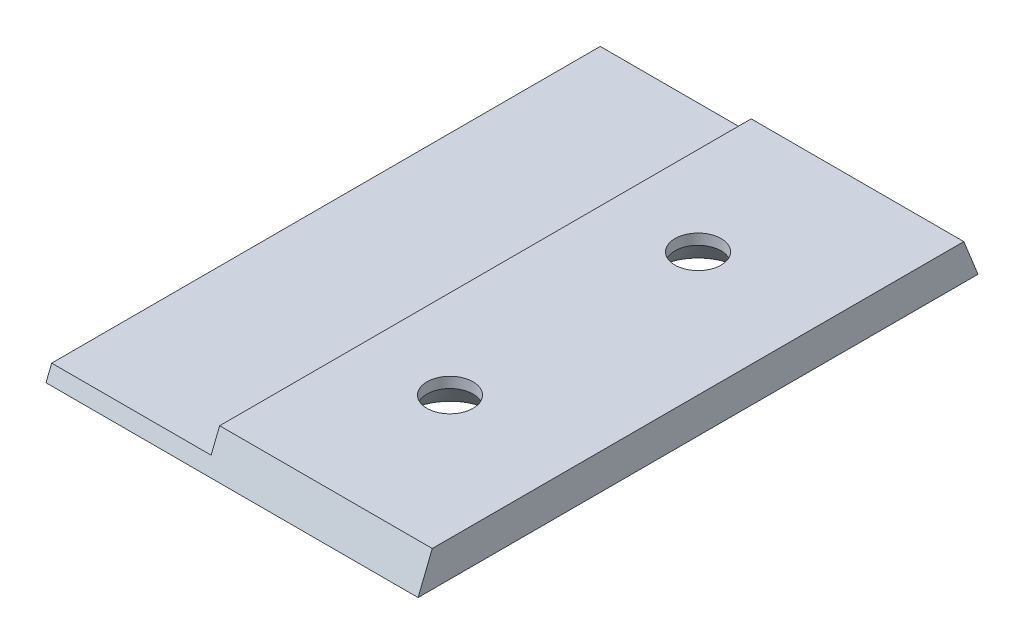
ISO-10303-21;
HEADER;
FILE_DESCRIPTION(('STEP AP214'),'2;1');
FILE_NAME('part.step','',(''),(''),'','','');
FILE_SCHEMA(('AUTOMOTIVE_DESIGN { 1 0 10303 214 1 1 1 1 }'));
ENDSEC;
DATA;
#1=APPLICATION_CONTEXT('core data for automotive mechanical design processes');
#2=APPLICATION_PROTOCOL_DEFINITION('international standard','automotive_design',2000,#1);
#3=PRODUCT_CONTEXT('',#1,'mechanical');
#4=PRODUCT('Part','Part','',(#3));
#5=PRODUCT_RELATED_PRODUCT_CATEGORY('part','',(#4));
#6=PRODUCT_DEFINITION_FORMATION('','',#4);
#7=PRODUCT_DEFINITION_CONTEXT('part definition',#1,'design');
#8=PRODUCT_DEFINITION('design','',#6,#7);
#9=PRODUCT_DEFINITION_SHAPE('','',#8);
#10=(LENGTH_UNIT() NAMED_UNIT(*) SI_UNIT(.MILLI.,.METRE.));
#11=(NAMED_UNIT(*) PLANE_ANGLE_UNIT() SI_UNIT($,.RADIAN.));
#12=(NAMED_UNIT(*) SI_UNIT($,.STERADIAN.) SOLID_ANGLE_UNIT());
#13=UNCERTAINTY_MEASURE_WITH_UNIT(LENGTH_MEASURE(1.E-05),#10,'distance_accuracy_value','');
#14=(GEOMETRIC_REPRESENTATION_CONTEXT(3) GLOBAL_UNCERTAINTY_ASSIGNED_CONTEXT((#13)) GLOBAL_UNIT_ASSIGNED_CONTEXT((#10,
#11,#12)) REPRESENTATION_CONTEXT('',''));
#15=CARTESIAN_POINT('',(0.,0.,0.));
#16=DIRECTION('',(0.,0.,1.));
#17=DIRECTION('',(1.,0.,0.));
#18=AXIS2_PLACEMENT_3D('',#15,#16,#17);
#19=CARTESIAN_POINT('',(52.5,10.,79.));
#20=DIRECTION('',(-1.,0.,0.));
#21=DIRECTION('',(0.,0.,1.));
#22=AXIS2_PLACEMENT_3D('',#19,#20,#21);
#23=PLANE('',#22);
#24=DIRECTION('',(0.,0.,-1.));
#25=VECTOR('',#24,1.);
#26=CARTESIAN_POINT('',(52.5,10.,79.));
#27=LINE('',#26,#25);
#28=CARTESIAN_POINT('',(52.5,10.,75.0002853592523));
#29=VERTEX_POINT('',#28);
#30=CARTESIAN_POINT('',(52.5,10.,-75.0002853592522));
#31=VERTEX_POINT('',#30);
#32=EDGE_CURVE('E122',#29,#31,#27,.T.);
#33=ORIENTED_EDGE('',*,*,#32,.F.);
#34=DIRECTION('',(0.,0.928485826880915,-0.371367835550232));
#35=VECTOR('',#34,1.);
#36=CARTESIAN_POINT('',(52.5,0.,79.));
#37=LINE('',#36,#35);
#38=CARTESIAN_POINT('',(52.5,0.,79.));
#39=VERTEX_POINT('',#38);
#40=EDGE_CURVE('E102',#39,#29,#37,.T.);
#41=ORIENTED_EDGE('',*,*,#40,.F.);
#42=DIRECTION('',(0.,0.,-1.));
#43=VECTOR('',#42,1.);
#44=CARTESIAN_POINT('',(52.5,0.,79.));
#45=LINE('',#44,#43);
#46=CARTESIAN_POINT('',(52.5,0.,-79.));
#47=VERTEX_POINT('',#46);
#48=EDGE_CURVE('E121',#39,#47,#45,.T.);
#49=ORIENTED_EDGE('',*,*,#48,.T.);
#50=DIRECTION('',(0.,-0.928485826880912,-0.371367835550239));
#51=VECTOR('',#50,1.);
#52=CARTESIAN_POINT('',(52.5,0.,-79.));
#53=LINE('',#52,#51);
#54=EDGE_CURVE('E112',#31,#47,#53,.T.);
#55=ORIENTED_EDGE('',*,*,#54,.F.);
#56=EDGE_LOOP('',(#33,#41,#49,#55));
#57=FACE_BOUND('',#56,.T.);
#58=ADVANCED_FACE('F33',(#57),#23,.F.);
#59=CARTESIAN_POINT('',(-52.5,10.,79.));
#60=DIRECTION('',(1.,0.,0.));
#61=DIRECTION('',(0.,0.,-1.));
#62=AXIS2_PLACEMENT_3D('',#59,#60,#61);
#63=PLANE('',#62);
#64=DIRECTION('',(0.,-0.928485826880915,0.371367835550232));
#65=VECTOR('',#64,1.);
#66=CARTESIAN_POINT('',(-52.5,0.,79.));
#67=LINE('',#66,#65);
#68=CARTESIAN_POINT('',(-52.5,4.,77.4001141437009));
#69=VERTEX_POINT('',#68);
#70=CARTESIAN_POINT('',(-52.5,0.,79.));
#71=VERTEX_POINT('',#70);
#72=EDGE_CURVE('E55',#69,#71,#67,.T.);
#73=ORIENTED_EDGE('',*,*,#72,.F.);
#74=DIRECTION('',(0.,0.,1.));
#75=VECTOR('',#74,1.);
#76=CARTESIAN_POINT('',(-52.5,4.,79.));
#77=LINE('',#76,#75);
#78=CARTESIAN_POINT('',(-52.5,4.,-77.4001141437009));
#79=VERTEX_POINT('',#78);
#80=EDGE_CURVE('E48',#79,#69,#77,.T.);
#81=ORIENTED_EDGE('',*,*,#80,.F.);
#82=DIRECTION('',(0.,0.928485826880912,0.371367835550239));
#83=VECTOR('',#82,1.);
#84=CARTESIAN_POINT('',(-52.5,0.,-79.));
#85=LINE('',#84,#83);
#86=CARTESIAN_POINT('',(-52.5,0.,-79.));
#87=VERTEX_POINT('',#86);
#88=EDGE_CURVE('E116',#87,#79,#85,.T.);
#89=ORIENTED_EDGE('',*,*,#88,.F.);
#90=DIRECTION('',(0.,0.,1.));
#91=VECTOR('',#90,1.);
#92=CARTESIAN_POINT('',(-52.5,0.,79.));
#93=LINE('',#92,#91);
#94=EDGE_CURVE('E130',#87,#71,#93,.T.);
#95=ORIENTED_EDGE('',*,*,#94,.T.);
#96=EDGE_LOOP('',(#73,#81,#89,#95));
#97=FACE_BOUND('',#96,.T.);
#98=ADVANCED_FACE('F144',(#97),#63,.F.);
#99=CARTESIAN_POINT('',(0.,10.,0.));
#100=DIRECTION('',(0.,-1.,0.));
#101=DIRECTION('',(0.,0.,-1.));
#102=AXIS2_PLACEMENT_3D('',#99,#100,#101);
#103=PLANE('',#102);
#104=CARTESIAN_POINT('',(17.5,10.,-35.));
#105=DIRECTION('',(0.,-1.,0.));
#106=DIRECTION('',(0.,0.,-1.));
#107=AXIS2_PLACEMENT_3D('',#104,#105,#106);
#108=CIRCLE('',#107,6.5);
#109=CARTESIAN_POINT('',(17.5,10.,-41.5));
#110=VERTEX_POINT('',#109);
#111=EDGE_CURVE('E104',#110,#110,#108,.F.);
#112=ORIENTED_EDGE('',*,*,#111,.F.);
#113=EDGE_LOOP('',(#112));
#114=FACE_BOUND('',#113,.T.);
#115=CARTESIAN_POINT('',(17.5,10.,35.));
#116=DIRECTION('',(0.,-1.,0.));
#117=DIRECTION('',(0.,0.,-1.));
#118=AXIS2_PLACEMENT_3D('',#115,#116,#117);
#119=CIRCLE('',#118,6.5);
#120=CARTESIAN_POINT('',(17.5,10.,28.5));
#121=VERTEX_POINT('',#120);
#122=EDGE_CURVE('E107',#121,#121,#119,.F.);
#123=ORIENTED_EDGE('',*,*,#122,.F.);
#124=EDGE_LOOP('',(#123));
#125=FACE_BOUND('',#124,.T.);
#126=DIRECTION('',(1.,0.,0.));
#127=VECTOR('',#126,1.);
#128=CARTESIAN_POINT('',(-52.501,10.,-75.0002853592522));
#129=LINE('',#128,#127);
#130=CARTESIAN_POINT('',(-7.50000000000001,10.,-75.0002853592522));
#131=VERTEX_POINT('',#130);
#132=EDGE_CURVE('E98',#131,#31,#129,.T.);
#133=ORIENTED_EDGE('',*,*,#132,.F.);
#134=DIRECTION('',(0.,0.,-1.));
#135=VECTOR('',#134,1.);
#136=CARTESIAN_POINT('',(-7.50000000000001,10.,-79.));
#137=LINE('',#136,#135);
#138=CARTESIAN_POINT('',(-7.49999999999999,10.,75.0002853592523));
#139=VERTEX_POINT('',#138);
#140=EDGE_CURVE('E87',#139,#131,#137,.T.);
#141=ORIENTED_EDGE('',*,*,#140,.F.);
#142=DIRECTION('',(1.,0.,0.));
#143=VECTOR('',#142,1.);
#144=CARTESIAN_POINT('',(-52.501,10.,75.0002853592523));
#145=LINE('',#144,#143);
#146=EDGE_CURVE('E96',#139,#29,#145,.T.);
#147=ORIENTED_EDGE('',*,*,#146,.T.);
#148=ORIENTED_EDGE('',*,*,#32,.T.);
#149=EDGE_LOOP('',(#133,#141,#147,#148));
#150=FACE_BOUND('',#149,.T.);
#151=ADVANCED_FACE('F94',(#114,#125,#150),#103,.F.);
#152=CARTESIAN_POINT('',(0.,0.,0.));
#153=DIRECTION('',(0.,-1.,0.));
#154=DIRECTION('',(0.,0.,-1.));
#155=AXIS2_PLACEMENT_3D('',#152,#153,#154);
#156=PLANE('',#155);
#157=CARTESIAN_POINT('',(17.5,0.,-35.));
#158=DIRECTION('',(0.,-1.,0.));
#159=DIRECTION('',(0.,0.,-1.));
#160=AXIS2_PLACEMENT_3D('',#157,#158,#159);
#161=CIRCLE('',#160,12.);
#162=CARTESIAN_POINT('',(17.5,0.,-47.));
#163=VERTEX_POINT('',#162);
#164=EDGE_CURVE('E141',#163,#163,#161,.F.);
#165=ORIENTED_EDGE('',*,*,#164,.T.);
#166=EDGE_LOOP('',(#165));
#167=FACE_BOUND('',#166,.T.);
#168=CARTESIAN_POINT('',(17.5,0.,35.));
#169=DIRECTION('',(0.,-1.,0.));
#170=DIRECTION('',(0.,0.,-1.));
#171=AXIS2_PLACEMENT_3D('',#168,#169,#170);
#172=CIRCLE('',#171,12.);
#173=CARTESIAN_POINT('',(17.5,0.,23.));
#174=VERTEX_POINT('',#173);
#175=EDGE_CURVE('E135',#174,#174,#172,.F.);
#176=ORIENTED_EDGE('',*,*,#175,.T.);
#177=EDGE_LOOP('',(#176));
#178=FACE_BOUND('',#177,.T.);
#179=ORIENTED_EDGE('',*,*,#48,.F.);
#180=DIRECTION('',(1.,0.,0.));
#181=VECTOR('',#180,1.);
#182=CARTESIAN_POINT('',(-52.5,0.,79.));
#183=LINE('',#182,#181);
#184=EDGE_CURVE('E125',#71,#39,#183,.T.);
#185=ORIENTED_EDGE('',*,*,#184,.F.);
#186=ORIENTED_EDGE('',*,*,#94,.F.);
#187=DIRECTION('',(-1.,0.,0.));
#188=VECTOR('',#187,1.);
#189=CARTESIAN_POINT('',(-52.5,0.,-79.));
#190=LINE('',#189,#188);
#191=EDGE_CURVE('E128',#47,#87,#190,.T.);
#192=ORIENTED_EDGE('',*,*,#191,.F.);
#193=EDGE_LOOP('',(#179,#185,#186,#192));
#194=FACE_BOUND('',#193,.T.);
#195=ADVANCED_FACE('F160',(#167,#178,#194),#156,.T.);
#196=CARTESIAN_POINT('',(17.5,10.001,35.));
#197=DIRECTION('',(0.,-1.,0.));
#198=DIRECTION('',(0.,0.,-1.));
#199=AXIS2_PLACEMENT_3D('',#196,#197,#198);
#200=CYLINDRICAL_SURFACE('',#199,6.5);
#201=CARTESIAN_POINT('',(17.5,7.,35.));
#202=DIRECTION('',(0.,-1.,0.));
#203=DIRECTION('',(0.,0.,-1.));
#204=AXIS2_PLACEMENT_3D('',#201,#202,#203);
#205=CIRCLE('',#204,6.5);
#206=CARTESIAN_POINT('',(17.5,7.,28.5));
#207=VERTEX_POINT('',#206);
#208=EDGE_CURVE('E124',#207,#207,#205,.T.);
#209=ORIENTED_EDGE('',*,*,#208,.T.);
#210=EDGE_LOOP('',(#209));
#211=FACE_BOUND('',#210,.T.);
#212=ORIENTED_EDGE('',*,*,#122,.T.);
#213=EDGE_LOOP('',(#212));
#214=FACE_BOUND('',#213,.T.);
#215=ADVANCED_FACE('F173',(#211,#214),#200,.F.);
#216=CARTESIAN_POINT('',(17.5,7.,35.));
#217=DIRECTION('',(0.,-1.,0.));
#218=DIRECTION('',(0.,0.,-1.));
#219=AXIS2_PLACEMENT_3D('',#216,#217,#218);
#220=CONICAL_SURFACE('',#219,6.5,0.665969237379109);
#221=ORIENTED_EDGE('',*,*,#175,.F.);
#222=EDGE_LOOP('',(#221));
#223=FACE_BOUND('',#222,.T.);
#224=ORIENTED_EDGE('',*,*,#208,.F.);
#225=EDGE_LOOP('',(#224));
#226=FACE_BOUND('',#225,.T.);
#227=ADVANCED_FACE('F170',(#223,#226),#220,.F.);
#228=CARTESIAN_POINT('',(17.5,10.001,-35.));
#229=DIRECTION('',(0.,-1.,0.));
#230=DIRECTION('',(0.,0.,-1.));
#231=AXIS2_PLACEMENT_3D('',#228,#229,#230);
#232=CYLINDRICAL_SURFACE('',#231,6.5);
#233=CARTESIAN_POINT('',(17.5,7.00000000000001,-35.));
#234=DIRECTION('',(0.,-1.,0.));
#235=DIRECTION('',(0.,0.,-1.));
#236=AXIS2_PLACEMENT_3D('',#233,#234,#235);
#237=CIRCLE('',#236,6.5);
#238=CARTESIAN_POINT('',(17.5,7.00000000000001,-41.5));
#239=VERTEX_POINT('',#238);
#240=EDGE_CURVE('E138',#239,#239,#237,.T.);
#241=ORIENTED_EDGE('',*,*,#240,.T.);
#242=EDGE_LOOP('',(#241));
#243=FACE_BOUND('',#242,.T.);
#244=ORIENTED_EDGE('',*,*,#111,.T.);
#245=EDGE_LOOP('',(#244));
#246=FACE_BOUND('',#245,.T.);
#247=ADVANCED_FACE('F172',(#243,#246),#232,.F.);
#248=CARTESIAN_POINT('',(17.5,7.00000000000001,-35.));
#249=DIRECTION('',(0.,-1.,0.));
#250=DIRECTION('',(0.,0.,-1.));
#251=AXIS2_PLACEMENT_3D('',#248,#249,#250);
#252=CONICAL_SURFACE('',#251,6.5,0.66596923737911);
#253=ORIENTED_EDGE('',*,*,#164,.F.);
#254=EDGE_LOOP('',(#253));
#255=FACE_BOUND('',#254,.T.);
#256=ORIENTED_EDGE('',*,*,#240,.F.);
#257=EDGE_LOOP('',(#256));
#258=FACE_BOUND('',#257,.T.);
#259=ADVANCED_FACE('F35',(#255,#258),#252,.F.);
#260=CARTESIAN_POINT('',(-52.501,0.,-79.));
#261=DIRECTION('',(0.,-0.371367835550239,0.928485826880912));
#262=DIRECTION('',(0.,-0.928485826880912,-0.371367835550239));
#263=AXIS2_PLACEMENT_3D('',#260,#261,#262);
#264=PLANE('',#263);
#265=DIRECTION('',(1.,0.,0.));
#266=VECTOR('',#265,1.);
#267=CARTESIAN_POINT('',(-52.501,4.,-77.4001141437009));
#268=LINE('',#267,#266);
#269=CARTESIAN_POINT('',(-7.50000000000001,4.,-77.4001141437009));
#270=VERTEX_POINT('',#269);
#271=EDGE_CURVE('E150',#79,#270,#268,.T.);
#272=ORIENTED_EDGE('',*,*,#271,.T.);
#273=DIRECTION('',(0.,0.928485826880912,0.371367835550239));
#274=VECTOR('',#273,1.);
#275=CARTESIAN_POINT('',(-7.50000000000001,0.,-79.));
#276=LINE('',#275,#274);
#277=EDGE_CURVE('E114',#270,#131,#276,.T.);
#278=ORIENTED_EDGE('',*,*,#277,.T.);
#279=ORIENTED_EDGE('',*,*,#132,.T.);
#280=ORIENTED_EDGE('',*,*,#54,.T.);
#281=ORIENTED_EDGE('',*,*,#191,.T.);
#282=ORIENTED_EDGE('',*,*,#88,.T.);
#283=EDGE_LOOP('',(#272,#278,#279,#280,#281,#282));
#284=FACE_BOUND('',#283,.T.);
#285=ADVANCED_FACE('F156',(#284),#264,.F.);
#286=CARTESIAN_POINT('',(-52.501,0.,79.));
#287=DIRECTION('',(0.,-0.371367835550232,-0.928485826880915));
#288=DIRECTION('',(0.,0.928485826880915,-0.371367835550232));
#289=AXIS2_PLACEMENT_3D('',#286,#287,#288);
#290=PLANE('',#289);
#291=ORIENTED_EDGE('',*,*,#146,.F.);
#292=DIRECTION('',(0.,-0.928485826880915,0.371367835550232));
#293=VECTOR('',#292,1.);
#294=CARTESIAN_POINT('',(-7.49999999999999,0.,79.));
#295=LINE('',#294,#293);
#296=CARTESIAN_POINT('',(-7.49999999999999,4.,77.4001141437009));
#297=VERTEX_POINT('',#296);
#298=EDGE_CURVE('E11',#139,#297,#295,.T.);
#299=ORIENTED_EDGE('',*,*,#298,.T.);
#300=DIRECTION('',(-1.,0.,0.));
#301=VECTOR('',#300,1.);
#302=CARTESIAN_POINT('',(-52.501,4.,77.4001141437009));
#303=LINE('',#302,#301);
#304=EDGE_CURVE('E41',#297,#69,#303,.T.);
#305=ORIENTED_EDGE('',*,*,#304,.T.);
#306=ORIENTED_EDGE('',*,*,#72,.T.);
#307=ORIENTED_EDGE('',*,*,#184,.T.);
#308=ORIENTED_EDGE('',*,*,#40,.T.);
#309=EDGE_LOOP('',(#291,#299,#305,#306,#307,#308));
#310=FACE_BOUND('',#309,.T.);
#311=ADVANCED_FACE('F100',(#310),#290,.F.);
#312=CARTESIAN_POINT('',(-7.50000000000001,4.,-79.));
#313=DIRECTION('',(1.,0.,0.));
#314=DIRECTION('',(0.,0.,-1.));
#315=AXIS2_PLACEMENT_3D('',#312,#313,#314);
#316=PLANE('',#315);
#317=DIRECTION('',(0.,0.,-1.));
#318=VECTOR('',#317,1.);
#319=CARTESIAN_POINT('',(-7.50000000000001,4.,-79.));
#320=LINE('',#319,#318);
#321=EDGE_CURVE('E90',#297,#270,#320,.T.);
#322=ORIENTED_EDGE('',*,*,#321,.F.);
#323=ORIENTED_EDGE('',*,*,#298,.F.);
#324=ORIENTED_EDGE('',*,*,#140,.T.);
#325=ORIENTED_EDGE('',*,*,#277,.F.);
#326=EDGE_LOOP('',(#322,#323,#324,#325));
#327=FACE_BOUND('',#326,.T.);
#328=ADVANCED_FACE('F86',(#327),#316,.F.);
#329=CARTESIAN_POINT('',(0.,4.,0.));
#330=DIRECTION('',(0.,-1.,0.));
#331=DIRECTION('',(0.,0.,-1.));
#332=AXIS2_PLACEMENT_3D('',#329,#330,#331);
#333=PLANE('',#332);
#334=ORIENTED_EDGE('',*,*,#80,.T.);
#335=ORIENTED_EDGE('',*,*,#304,.F.);
#336=ORIENTED_EDGE('',*,*,#321,.T.);
#337=ORIENTED_EDGE('',*,*,#271,.F.);
#338=EDGE_LOOP('',(#334,#335,#336,#337));
#339=FACE_BOUND('',#338,.T.);
#340=ADVANCED_FACE('F154',(#339),#333,.F.);
#341=CLOSED_SHELL('',(#58,#98,#151,#195,#215,#227,#247,#259,#285,#311,#328,#340));
#342=MANIFOLD_SOLID_BREP('B2',#341);
#343=ADVANCED_BREP_SHAPE_REPRESENTATION('',(#18,#342),#14);
#344=SHAPE_DEFINITION_REPRESENTATION(#9,#343);
ENDSEC;
END-ISO-10303-21;
